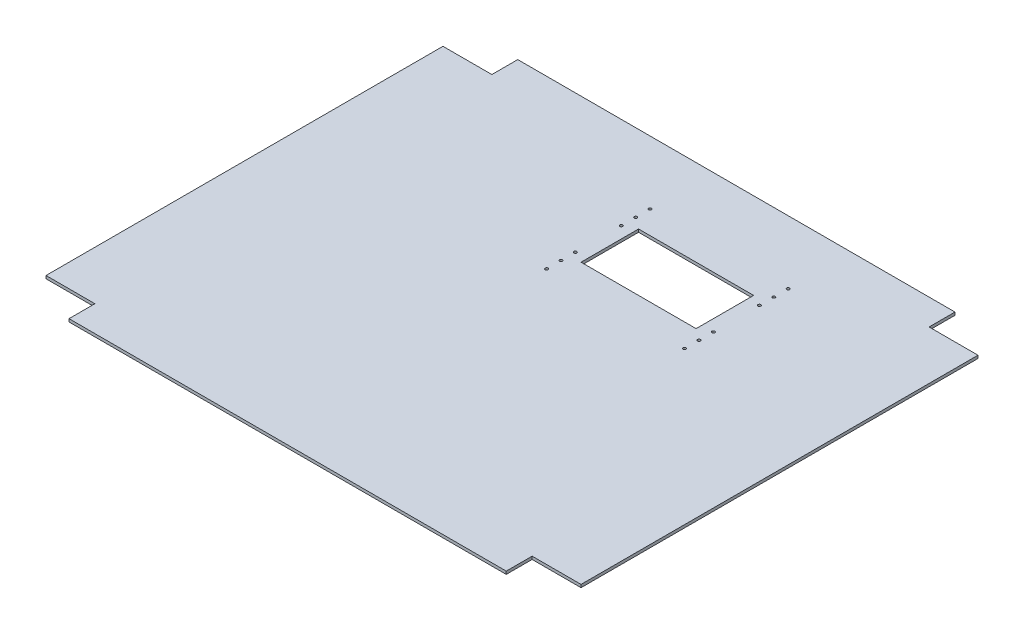
ISO-10303-21;
HEADER;
FILE_DESCRIPTION(('STEP AP214'),'2;1');
FILE_NAME('part.step','',(''),(''),'','','');
FILE_SCHEMA(('AUTOMOTIVE_DESIGN { 1 0 10303 214 1 1 1 1 }'));
ENDSEC;
DATA;
#1=APPLICATION_CONTEXT('core data for automotive mechanical design processes');
#2=APPLICATION_PROTOCOL_DEFINITION('international standard','automotive_design',2000,#1);
#3=PRODUCT_CONTEXT('',#1,'mechanical');
#4=PRODUCT('Part','Part','',(#3));
#5=PRODUCT_RELATED_PRODUCT_CATEGORY('part','',(#4));
#6=PRODUCT_DEFINITION_FORMATION('','',#4);
#7=PRODUCT_DEFINITION_CONTEXT('part definition',#1,'design');
#8=PRODUCT_DEFINITION('design','',#6,#7);
#9=PRODUCT_DEFINITION_SHAPE('','',#8);
#10=(LENGTH_UNIT() NAMED_UNIT(*) SI_UNIT(.MILLI.,.METRE.));
#11=(NAMED_UNIT(*) PLANE_ANGLE_UNIT() SI_UNIT($,.RADIAN.));
#12=(NAMED_UNIT(*) SI_UNIT($,.STERADIAN.) SOLID_ANGLE_UNIT());
#13=UNCERTAINTY_MEASURE_WITH_UNIT(LENGTH_MEASURE(1.E-05),#10,'distance_accuracy_value','');
#14=(GEOMETRIC_REPRESENTATION_CONTEXT(3) GLOBAL_UNCERTAINTY_ASSIGNED_CONTEXT((#13)) GLOBAL_UNIT_ASSIGNED_CONTEXT((#10,
#11,#12)) REPRESENTATION_CONTEXT('',''));
#15=CARTESIAN_POINT('',(0.,0.,0.));
#16=DIRECTION('',(0.,0.,1.));
#17=DIRECTION('',(1.,0.,0.));
#18=AXIS2_PLACEMENT_3D('',#15,#16,#17);
#19=CARTESIAN_POINT('',(0.,0.,0.));
#20=DIRECTION('',(0.,-1.,0.));
#21=DIRECTION('',(0.,0.,-1.));
#22=AXIS2_PLACEMENT_3D('',#19,#20,#21);
#23=PLANE('',#22);
#24=CARTESIAN_POINT('',(200.,0.,-125.));
#25=DIRECTION('',(0.,1.,0.));
#26=DIRECTION('',(0.,0.,1.));
#27=AXIS2_PLACEMENT_3D('',#24,#25,#26);
#28=CIRCLE('',#27,2.5);
#29=CARTESIAN_POINT('',(200.,0.,-122.5));
#30=VERTEX_POINT('',#29);
#31=EDGE_CURVE('E656',#30,#30,#28,.T.);
#32=ORIENTED_EDGE('',*,*,#31,.F.);
#33=EDGE_LOOP('',(#32));
#34=FACE_BOUND('',#33,.T.);
#35=CARTESIAN_POINT('',(200.,0.,-280.));
#36=DIRECTION('',(0.,1.,0.));
#37=DIRECTION('',(0.,0.,1.));
#38=AXIS2_PLACEMENT_3D('',#35,#36,#37);
#39=CIRCLE('',#38,2.5);
#40=CARTESIAN_POINT('',(200.,0.,-277.5));
#41=VERTEX_POINT('',#40);
#42=EDGE_CURVE('E670',#41,#41,#39,.T.);
#43=ORIENTED_EDGE('',*,*,#42,.F.);
#44=EDGE_LOOP('',(#43));
#45=FACE_BOUND('',#44,.T.);
#46=CARTESIAN_POINT('',(200.,0.,-230.));
#47=DIRECTION('',(0.,1.,0.));
#48=DIRECTION('',(0.,0.,1.));
#49=AXIS2_PLACEMENT_3D('',#46,#47,#48);
#50=CIRCLE('',#49,2.5);
#51=CARTESIAN_POINT('',(200.,0.,-227.5));
#52=VERTEX_POINT('',#51);
#53=EDGE_CURVE('E682',#52,#52,#50,.T.);
#54=ORIENTED_EDGE('',*,*,#53,.F.);
#55=EDGE_LOOP('',(#54));
#56=FACE_BOUND('',#55,.T.);
#57=CARTESIAN_POINT('',(-40.0000000000005,0.,-125.));
#58=DIRECTION('',(0.,1.,0.));
#59=DIRECTION('',(0.,0.,1.));
#60=AXIS2_PLACEMENT_3D('',#57,#58,#59);
#61=CIRCLE('',#60,2.5);
#62=CARTESIAN_POINT('',(-40.0000000000005,0.,-122.5));
#63=VERTEX_POINT('',#62);
#64=EDGE_CURVE('E694',#63,#63,#61,.T.);
#65=ORIENTED_EDGE('',*,*,#64,.F.);
#66=EDGE_LOOP('',(#65));
#67=FACE_BOUND('',#66,.T.);
#68=DIRECTION('',(0.,0.,1.));
#69=VECTOR('',#68,1.);
#70=CARTESIAN_POINT('',(-465.,0.,390.));
#71=LINE('',#70,#69);
#72=CARTESIAN_POINT('',(-465.,0.,-345.));
#73=VERTEX_POINT('',#72);
#74=CARTESIAN_POINT('',(-465.,0.,345.));
#75=VERTEX_POINT('',#74);
#76=EDGE_CURVE('E254',#73,#75,#71,.T.);
#77=ORIENTED_EDGE('',*,*,#76,.T.);
#78=DIRECTION('',(-1.,0.,0.));
#79=VECTOR('',#78,1.);
#80=CARTESIAN_POINT('',(-465.,0.,345.));
#81=LINE('',#80,#79);
#82=CARTESIAN_POINT('',(-380.,0.,345.));
#83=VERTEX_POINT('',#82);
#84=EDGE_CURVE('E175',#83,#75,#81,.T.);
#85=ORIENTED_EDGE('',*,*,#84,.F.);
#86=DIRECTION('',(0.,0.,-1.));
#87=VECTOR('',#86,1.);
#88=CARTESIAN_POINT('',(-380.,0.,390.));
#89=LINE('',#88,#87);
#90=CARTESIAN_POINT('',(-380.,0.,390.));
#91=VERTEX_POINT('',#90);
#92=EDGE_CURVE('E167',#91,#83,#89,.T.);
#93=ORIENTED_EDGE('',*,*,#92,.F.);
#94=DIRECTION('',(1.,0.,0.));
#95=VECTOR('',#94,1.);
#96=CARTESIAN_POINT('',(-465.,0.,390.));
#97=LINE('',#96,#95);
#98=CARTESIAN_POINT('',(380.,0.,390.));
#99=VERTEX_POINT('',#98);
#100=EDGE_CURVE('E21',#91,#99,#97,.T.);
#101=ORIENTED_EDGE('',*,*,#100,.T.);
#102=DIRECTION('',(0.,0.,1.));
#103=VECTOR('',#102,1.);
#104=CARTESIAN_POINT('',(380.,0.,390.));
#105=LINE('',#104,#103);
#106=CARTESIAN_POINT('',(380.,0.,345.));
#107=VERTEX_POINT('',#106);
#108=EDGE_CURVE('E193',#107,#99,#105,.T.);
#109=ORIENTED_EDGE('',*,*,#108,.F.);
#110=DIRECTION('',(-1.,0.,0.));
#111=VECTOR('',#110,1.);
#112=CARTESIAN_POINT('',(465.,0.,345.));
#113=LINE('',#112,#111);
#114=CARTESIAN_POINT('',(465.,0.,345.));
#115=VERTEX_POINT('',#114);
#116=EDGE_CURVE('E185',#115,#107,#113,.T.);
#117=ORIENTED_EDGE('',*,*,#116,.F.);
#118=DIRECTION('',(0.,0.,-1.));
#119=VECTOR('',#118,1.);
#120=CARTESIAN_POINT('',(465.,0.,390.));
#121=LINE('',#120,#119);
#122=CARTESIAN_POINT('',(465.,0.,-345.));
#123=VERTEX_POINT('',#122);
#124=EDGE_CURVE('E242',#115,#123,#121,.T.);
#125=ORIENTED_EDGE('',*,*,#124,.T.);
#126=DIRECTION('',(1.,0.,0.));
#127=VECTOR('',#126,1.);
#128=CARTESIAN_POINT('',(465.,0.,-345.));
#129=LINE('',#128,#127);
#130=CARTESIAN_POINT('',(380.,0.,-345.));
#131=VERTEX_POINT('',#130);
#132=EDGE_CURVE('E212',#131,#123,#129,.T.);
#133=ORIENTED_EDGE('',*,*,#132,.F.);
#134=DIRECTION('',(0.,0.,1.));
#135=VECTOR('',#134,1.);
#136=CARTESIAN_POINT('',(380.,0.,-390.));
#137=LINE('',#136,#135);
#138=CARTESIAN_POINT('',(380.,0.,-390.));
#139=VERTEX_POINT('',#138);
#140=EDGE_CURVE('E204',#139,#131,#137,.T.);
#141=ORIENTED_EDGE('',*,*,#140,.F.);
#142=DIRECTION('',(-1.,0.,0.));
#143=VECTOR('',#142,1.);
#144=CARTESIAN_POINT('',(-465.,0.,-390.));
#145=LINE('',#144,#143);
#146=CARTESIAN_POINT('',(-380.,0.,-390.));
#147=VERTEX_POINT('',#146);
#148=EDGE_CURVE('E253',#139,#147,#145,.T.);
#149=ORIENTED_EDGE('',*,*,#148,.T.);
#150=DIRECTION('',(0.,0.,-1.));
#151=VECTOR('',#150,1.);
#152=CARTESIAN_POINT('',(-380.,0.,-390.));
#153=LINE('',#152,#151);
#154=CARTESIAN_POINT('',(-380.,0.,-345.));
#155=VERTEX_POINT('',#154);
#156=EDGE_CURVE('E231',#155,#147,#153,.T.);
#157=ORIENTED_EDGE('',*,*,#156,.F.);
#158=DIRECTION('',(1.,0.,0.));
#159=VECTOR('',#158,1.);
#160=CARTESIAN_POINT('',(-465.,0.,-345.));
#161=LINE('',#160,#159);
#162=EDGE_CURVE('E223',#73,#155,#161,.T.);
#163=ORIENTED_EDGE('',*,*,#162,.F.);
#164=EDGE_LOOP('',(#77,#85,#93,#101,#109,#117,#125,#133,#141,#149,#157,#163));
#165=FACE_BOUND('',#164,.T.);
#166=DIRECTION('',(-1.,0.,0.));
#167=VECTOR('',#166,1.);
#168=CARTESIAN_POINT('',(-20.0000000000002,0.,-240.));
#169=LINE('',#168,#167);
#170=CARTESIAN_POINT('',(180.,0.,-240.));
#171=VERTEX_POINT('',#170);
#172=CARTESIAN_POINT('',(-20.0000000000002,0.,-240.));
#173=VERTEX_POINT('',#172);
#174=EDGE_CURVE('E161',#171,#173,#169,.T.);
#175=ORIENTED_EDGE('',*,*,#174,.F.);
#176=DIRECTION('',(0.,0.,-1.));
#177=VECTOR('',#176,1.);
#178=CARTESIAN_POINT('',(180.,0.,-240.));
#179=LINE('',#178,#177);
#180=CARTESIAN_POINT('',(180.,0.,-140.));
#181=VERTEX_POINT('',#180);
#182=EDGE_CURVE('E42',#181,#171,#179,.T.);
#183=ORIENTED_EDGE('',*,*,#182,.F.);
#184=DIRECTION('',(1.,0.,0.));
#185=VECTOR('',#184,1.);
#186=CARTESIAN_POINT('',(-20.0000000000002,0.,-140.));
#187=LINE('',#186,#185);
#188=CARTESIAN_POINT('',(-20.0000000000002,0.,-140.));
#189=VERTEX_POINT('',#188);
#190=EDGE_CURVE('E149',#189,#181,#187,.T.);
#191=ORIENTED_EDGE('',*,*,#190,.F.);
#192=DIRECTION('',(0.,0.,1.));
#193=VECTOR('',#192,1.);
#194=CARTESIAN_POINT('',(-20.0000000000002,0.,-240.));
#195=LINE('',#194,#193);
#196=EDGE_CURVE('E152',#173,#189,#195,.T.);
#197=ORIENTED_EDGE('',*,*,#196,.F.);
#198=EDGE_LOOP('',(#175,#183,#191,#197));
#199=FACE_BOUND('',#198,.T.);
#200=CARTESIAN_POINT('',(-40.,0.,-230.));
#201=DIRECTION('',(0.,1.,0.));
#202=DIRECTION('',(0.,0.,1.));
#203=AXIS2_PLACEMENT_3D('',#200,#201,#202);
#204=CIRCLE('',#203,2.5);
#205=CARTESIAN_POINT('',(-40.,0.,-227.5));
#206=VERTEX_POINT('',#205);
#207=EDGE_CURVE('E717',#206,#206,#204,.T.);
#208=ORIENTED_EDGE('',*,*,#207,.F.);
#209=EDGE_LOOP('',(#208));
#210=FACE_BOUND('',#209,.T.);
#211=CARTESIAN_POINT('',(-40.,0.,-255.));
#212=DIRECTION('',(0.,1.,0.));
#213=DIRECTION('',(0.,0.,1.));
#214=AXIS2_PLACEMENT_3D('',#211,#212,#213);
#215=CIRCLE('',#214,2.5);
#216=CARTESIAN_POINT('',(-40.,0.,-252.5));
#217=VERTEX_POINT('',#216);
#218=EDGE_CURVE('E712',#217,#217,#215,.T.);
#219=ORIENTED_EDGE('',*,*,#218,.F.);
#220=EDGE_LOOP('',(#219));
#221=FACE_BOUND('',#220,.T.);
#222=CARTESIAN_POINT('',(-40.,0.,-280.));
#223=DIRECTION('',(0.,1.,0.));
#224=DIRECTION('',(0.,0.,1.));
#225=AXIS2_PLACEMENT_3D('',#222,#223,#224);
#226=CIRCLE('',#225,2.5);
#227=CARTESIAN_POINT('',(-40.,0.,-277.5));
#228=VERTEX_POINT('',#227);
#229=EDGE_CURVE('E706',#228,#228,#226,.T.);
#230=ORIENTED_EDGE('',*,*,#229,.F.);
#231=EDGE_LOOP('',(#230));
#232=FACE_BOUND('',#231,.T.);
#233=CARTESIAN_POINT('',(-40.0000000000005,0.,-100.));
#234=DIRECTION('',(0.,1.,0.));
#235=DIRECTION('',(0.,0.,1.));
#236=AXIS2_PLACEMENT_3D('',#233,#234,#235);
#237=CIRCLE('',#236,2.5);
#238=CARTESIAN_POINT('',(-40.0000000000005,0.,-97.5));
#239=VERTEX_POINT('',#238);
#240=EDGE_CURVE('E700',#239,#239,#237,.T.);
#241=ORIENTED_EDGE('',*,*,#240,.F.);
#242=EDGE_LOOP('',(#241));
#243=FACE_BOUND('',#242,.T.);
#244=CARTESIAN_POINT('',(-40.0000000000005,0.,-150.));
#245=DIRECTION('',(0.,1.,0.));
#246=DIRECTION('',(0.,0.,1.));
#247=AXIS2_PLACEMENT_3D('',#244,#245,#246);
#248=CIRCLE('',#247,2.5);
#249=CARTESIAN_POINT('',(-40.0000000000005,0.,-147.5));
#250=VERTEX_POINT('',#249);
#251=EDGE_CURVE('E688',#250,#250,#248,.T.);
#252=ORIENTED_EDGE('',*,*,#251,.F.);
#253=EDGE_LOOP('',(#252));
#254=FACE_BOUND('',#253,.T.);
#255=CARTESIAN_POINT('',(200.,0.,-255.));
#256=DIRECTION('',(0.,1.,0.));
#257=DIRECTION('',(0.,0.,1.));
#258=AXIS2_PLACEMENT_3D('',#255,#256,#257);
#259=CIRCLE('',#258,2.5);
#260=CARTESIAN_POINT('',(200.,0.,-252.5));
#261=VERTEX_POINT('',#260);
#262=EDGE_CURVE('E676',#261,#261,#259,.T.);
#263=ORIENTED_EDGE('',*,*,#262,.F.);
#264=EDGE_LOOP('',(#263));
#265=FACE_BOUND('',#264,.T.);
#266=CARTESIAN_POINT('',(200.,0.,-100.));
#267=DIRECTION('',(0.,1.,0.));
#268=DIRECTION('',(0.,0.,1.));
#269=AXIS2_PLACEMENT_3D('',#266,#267,#268);
#270=CIRCLE('',#269,2.5);
#271=CARTESIAN_POINT('',(200.,0.,-97.5));
#272=VERTEX_POINT('',#271);
#273=EDGE_CURVE('E664',#272,#272,#270,.T.);
#274=ORIENTED_EDGE('',*,*,#273,.F.);
#275=EDGE_LOOP('',(#274));
#276=FACE_BOUND('',#275,.T.);
#277=CARTESIAN_POINT('',(200.,0.,-150.));
#278=DIRECTION('',(0.,1.,0.));
#279=DIRECTION('',(0.,0.,1.));
#280=AXIS2_PLACEMENT_3D('',#277,#278,#279);
#281=CIRCLE('',#280,2.5);
#282=CARTESIAN_POINT('',(200.,0.,-147.5));
#283=VERTEX_POINT('',#282);
#284=EDGE_CURVE('E653',#283,#283,#281,.T.);
#285=ORIENTED_EDGE('',*,*,#284,.F.);
#286=EDGE_LOOP('',(#285));
#287=FACE_BOUND('',#286,.T.);
#288=ADVANCED_FACE('F17',(#34,#45,#56,#67,#165,#199,#210,#221,#232,#243,#254,#265,#276,#287),
#23,.F.);
#289=CARTESIAN_POINT('',(0.,-5.,0.));
#290=DIRECTION('',(0.,-1.,0.));
#291=DIRECTION('',(0.,0.,-1.));
#292=AXIS2_PLACEMENT_3D('',#289,#290,#291);
#293=PLANE('',#292);
#294=CARTESIAN_POINT('',(200.,-5.,-125.));
#295=DIRECTION('',(0.,1.,0.));
#296=DIRECTION('',(0.,0.,1.));
#297=AXIS2_PLACEMENT_3D('',#294,#295,#296);
#298=CIRCLE('',#297,2.5);
#299=CARTESIAN_POINT('',(200.,-5.,-122.5));
#300=VERTEX_POINT('',#299);
#301=EDGE_CURVE('E661',#300,#300,#298,.T.);
#302=ORIENTED_EDGE('',*,*,#301,.T.);
#303=EDGE_LOOP('',(#302));
#304=FACE_BOUND('',#303,.T.);
#305=CARTESIAN_POINT('',(200.,-5.,-280.));
#306=DIRECTION('',(0.,1.,0.));
#307=DIRECTION('',(0.,0.,1.));
#308=AXIS2_PLACEMENT_3D('',#305,#306,#307);
#309=CIRCLE('',#308,2.5);
#310=CARTESIAN_POINT('',(200.,-5.,-277.5));
#311=VERTEX_POINT('',#310);
#312=EDGE_CURVE('E673',#311,#311,#309,.T.);
#313=ORIENTED_EDGE('',*,*,#312,.T.);
#314=EDGE_LOOP('',(#313));
#315=FACE_BOUND('',#314,.T.);
#316=CARTESIAN_POINT('',(200.,-5.,-230.));
#317=DIRECTION('',(0.,1.,0.));
#318=DIRECTION('',(0.,0.,1.));
#319=AXIS2_PLACEMENT_3D('',#316,#317,#318);
#320=CIRCLE('',#319,2.5);
#321=CARTESIAN_POINT('',(200.,-5.,-227.5));
#322=VERTEX_POINT('',#321);
#323=EDGE_CURVE('E685',#322,#322,#320,.T.);
#324=ORIENTED_EDGE('',*,*,#323,.T.);
#325=EDGE_LOOP('',(#324));
#326=FACE_BOUND('',#325,.T.);
#327=CARTESIAN_POINT('',(-40.0000000000005,-5.,-125.));
#328=DIRECTION('',(0.,1.,0.));
#329=DIRECTION('',(0.,0.,1.));
#330=AXIS2_PLACEMENT_3D('',#327,#328,#329);
#331=CIRCLE('',#330,2.5);
#332=CARTESIAN_POINT('',(-40.0000000000005,-5.,-122.5));
#333=VERTEX_POINT('',#332);
#334=EDGE_CURVE('E697',#333,#333,#331,.T.);
#335=ORIENTED_EDGE('',*,*,#334,.T.);
#336=EDGE_LOOP('',(#335));
#337=FACE_BOUND('',#336,.T.);
#338=CARTESIAN_POINT('',(-40.,-5.,-255.));
#339=DIRECTION('',(0.,1.,0.));
#340=DIRECTION('',(0.,0.,1.));
#341=AXIS2_PLACEMENT_3D('',#338,#339,#340);
#342=CIRCLE('',#341,2.5);
#343=CARTESIAN_POINT('',(-40.,-5.,-252.5));
#344=VERTEX_POINT('',#343);
#345=EDGE_CURVE('E715',#344,#344,#342,.T.);
#346=ORIENTED_EDGE('',*,*,#345,.T.);
#347=EDGE_LOOP('',(#346));
#348=FACE_BOUND('',#347,.T.);
#349=CARTESIAN_POINT('',(-40.,-5.,-230.));
#350=DIRECTION('',(0.,1.,0.));
#351=DIRECTION('',(0.,0.,1.));
#352=AXIS2_PLACEMENT_3D('',#349,#350,#351);
#353=CIRCLE('',#352,2.5);
#354=CARTESIAN_POINT('',(-40.,-5.,-227.5));
#355=VERTEX_POINT('',#354);
#356=EDGE_CURVE('E155',#355,#355,#353,.T.);
#357=ORIENTED_EDGE('',*,*,#356,.T.);
#358=EDGE_LOOP('',(#357));
#359=FACE_BOUND('',#358,.T.);
#360=DIRECTION('',(0.,0.,-1.));
#361=VECTOR('',#360,1.);
#362=CARTESIAN_POINT('',(180.,-5.,-240.));
#363=LINE('',#362,#361);
#364=CARTESIAN_POINT('',(180.,-5.,-140.));
#365=VERTEX_POINT('',#364);
#366=CARTESIAN_POINT('',(180.,-5.,-240.));
#367=VERTEX_POINT('',#366);
#368=EDGE_CURVE('E133',#365,#367,#363,.T.);
#369=ORIENTED_EDGE('',*,*,#368,.T.);
#370=DIRECTION('',(-1.,0.,0.));
#371=VECTOR('',#370,1.);
#372=CARTESIAN_POINT('',(-20.0000000000002,-5.,-240.));
#373=LINE('',#372,#371);
#374=CARTESIAN_POINT('',(-20.0000000000002,-5.,-240.));
#375=VERTEX_POINT('',#374);
#376=EDGE_CURVE('E142',#367,#375,#373,.T.);
#377=ORIENTED_EDGE('',*,*,#376,.T.);
#378=DIRECTION('',(0.,0.,1.));
#379=VECTOR('',#378,1.);
#380=CARTESIAN_POINT('',(-20.0000000000002,-5.,-240.));
#381=LINE('',#380,#379);
#382=CARTESIAN_POINT('',(-20.0000000000002,-5.,-140.));
#383=VERTEX_POINT('',#382);
#384=EDGE_CURVE('E34',#375,#383,#381,.T.);
#385=ORIENTED_EDGE('',*,*,#384,.T.);
#386=DIRECTION('',(1.,0.,0.));
#387=VECTOR('',#386,1.);
#388=CARTESIAN_POINT('',(-20.0000000000002,-5.,-140.));
#389=LINE('',#388,#387);
#390=EDGE_CURVE('E139',#383,#365,#389,.T.);
#391=ORIENTED_EDGE('',*,*,#390,.T.);
#392=EDGE_LOOP('',(#369,#377,#385,#391));
#393=FACE_BOUND('',#392,.T.);
#394=DIRECTION('',(-1.,0.,0.));
#395=VECTOR('',#394,1.);
#396=CARTESIAN_POINT('',(-465.,-5.,345.));
#397=LINE('',#396,#395);
#398=CARTESIAN_POINT('',(-380.,-5.,345.));
#399=VERTEX_POINT('',#398);
#400=CARTESIAN_POINT('',(-465.,-5.,345.));
#401=VERTEX_POINT('',#400);
#402=EDGE_CURVE('E174',#399,#401,#397,.T.);
#403=ORIENTED_EDGE('',*,*,#402,.T.);
#404=DIRECTION('',(0.,0.,1.));
#405=VECTOR('',#404,1.);
#406=CARTESIAN_POINT('',(-465.,-5.,390.));
#407=LINE('',#406,#405);
#408=CARTESIAN_POINT('',(-465.,-5.,-345.));
#409=VERTEX_POINT('',#408);
#410=EDGE_CURVE('E26',#409,#401,#407,.T.);
#411=ORIENTED_EDGE('',*,*,#410,.F.);
#412=DIRECTION('',(1.,0.,0.));
#413=VECTOR('',#412,1.);
#414=CARTESIAN_POINT('',(-465.,-5.,-345.));
#415=LINE('',#414,#413);
#416=CARTESIAN_POINT('',(-380.,-5.,-345.));
#417=VERTEX_POINT('',#416);
#418=EDGE_CURVE('E227',#409,#417,#415,.T.);
#419=ORIENTED_EDGE('',*,*,#418,.T.);
#420=DIRECTION('',(0.,0.,-1.));
#421=VECTOR('',#420,1.);
#422=CARTESIAN_POINT('',(-380.,-5.,-390.));
#423=LINE('',#422,#421);
#424=CARTESIAN_POINT('',(-380.,-5.,-390.));
#425=VERTEX_POINT('',#424);
#426=EDGE_CURVE('E230',#417,#425,#423,.T.);
#427=ORIENTED_EDGE('',*,*,#426,.T.);
#428=DIRECTION('',(-1.,0.,0.));
#429=VECTOR('',#428,1.);
#430=CARTESIAN_POINT('',(-465.,-5.,-390.));
#431=LINE('',#430,#429);
#432=CARTESIAN_POINT('',(380.,-5.,-390.));
#433=VERTEX_POINT('',#432);
#434=EDGE_CURVE('E248',#433,#425,#431,.T.);
#435=ORIENTED_EDGE('',*,*,#434,.F.);
#436=DIRECTION('',(0.,0.,1.));
#437=VECTOR('',#436,1.);
#438=CARTESIAN_POINT('',(380.,-5.,-390.));
#439=LINE('',#438,#437);
#440=CARTESIAN_POINT('',(380.,-5.,-345.));
#441=VERTEX_POINT('',#440);
#442=EDGE_CURVE('E208',#433,#441,#439,.T.);
#443=ORIENTED_EDGE('',*,*,#442,.T.);
#444=DIRECTION('',(1.,0.,0.));
#445=VECTOR('',#444,1.);
#446=CARTESIAN_POINT('',(465.,-5.,-345.));
#447=LINE('',#446,#445);
#448=CARTESIAN_POINT('',(465.,-5.,-345.));
#449=VERTEX_POINT('',#448);
#450=EDGE_CURVE('E211',#441,#449,#447,.T.);
#451=ORIENTED_EDGE('',*,*,#450,.T.);
#452=DIRECTION('',(0.,0.,-1.));
#453=VECTOR('',#452,1.);
#454=CARTESIAN_POINT('',(465.,-5.,390.));
#455=LINE('',#454,#453);
#456=CARTESIAN_POINT('',(465.,-5.,345.));
#457=VERTEX_POINT('',#456);
#458=EDGE_CURVE('E246',#457,#449,#455,.T.);
#459=ORIENTED_EDGE('',*,*,#458,.F.);
#460=DIRECTION('',(-1.,0.,0.));
#461=VECTOR('',#460,1.);
#462=CARTESIAN_POINT('',(465.,-5.,345.));
#463=LINE('',#462,#461);
#464=CARTESIAN_POINT('',(380.,-5.,345.));
#465=VERTEX_POINT('',#464);
#466=EDGE_CURVE('E189',#457,#465,#463,.T.);
#467=ORIENTED_EDGE('',*,*,#466,.T.);
#468=DIRECTION('',(0.,0.,1.));
#469=VECTOR('',#468,1.);
#470=CARTESIAN_POINT('',(380.,-5.,390.));
#471=LINE('',#470,#469);
#472=CARTESIAN_POINT('',(380.,-5.,390.));
#473=VERTEX_POINT('',#472);
#474=EDGE_CURVE('E192',#465,#473,#471,.T.);
#475=ORIENTED_EDGE('',*,*,#474,.T.);
#476=DIRECTION('',(1.,0.,0.));
#477=VECTOR('',#476,1.);
#478=CARTESIAN_POINT('',(-465.,-5.,390.));
#479=LINE('',#478,#477);
#480=CARTESIAN_POINT('',(-380.,-5.,390.));
#481=VERTEX_POINT('',#480);
#482=EDGE_CURVE('E11',#481,#473,#479,.T.);
#483=ORIENTED_EDGE('',*,*,#482,.F.);
#484=DIRECTION('',(0.,0.,-1.));
#485=VECTOR('',#484,1.);
#486=CARTESIAN_POINT('',(-380.,-5.,390.));
#487=LINE('',#486,#485);
#488=EDGE_CURVE('E171',#481,#399,#487,.T.);
#489=ORIENTED_EDGE('',*,*,#488,.T.);
#490=EDGE_LOOP('',(#403,#411,#419,#427,#435,#443,#451,#459,#467,#475,#483,#489));
#491=FACE_BOUND('',#490,.T.);
#492=CARTESIAN_POINT('',(-40.,-5.,-280.));
#493=DIRECTION('',(0.,1.,0.));
#494=DIRECTION('',(0.,0.,1.));
#495=AXIS2_PLACEMENT_3D('',#492,#493,#494);
#496=CIRCLE('',#495,2.5);
#497=CARTESIAN_POINT('',(-40.,-5.,-277.5));
#498=VERTEX_POINT('',#497);
#499=EDGE_CURVE('E709',#498,#498,#496,.T.);
#500=ORIENTED_EDGE('',*,*,#499,.T.);
#501=EDGE_LOOP('',(#500));
#502=FACE_BOUND('',#501,.T.);
#503=CARTESIAN_POINT('',(-40.0000000000005,-5.,-100.));
#504=DIRECTION('',(0.,1.,0.));
#505=DIRECTION('',(0.,0.,1.));
#506=AXIS2_PLACEMENT_3D('',#503,#504,#505);
#507=CIRCLE('',#506,2.5);
#508=CARTESIAN_POINT('',(-40.0000000000005,-5.,-97.5));
#509=VERTEX_POINT('',#508);
#510=EDGE_CURVE('E703',#509,#509,#507,.T.);
#511=ORIENTED_EDGE('',*,*,#510,.T.);
#512=EDGE_LOOP('',(#511));
#513=FACE_BOUND('',#512,.T.);
#514=CARTESIAN_POINT('',(-40.0000000000005,-5.,-150.));
#515=DIRECTION('',(0.,1.,0.));
#516=DIRECTION('',(0.,0.,1.));
#517=AXIS2_PLACEMENT_3D('',#514,#515,#516);
#518=CIRCLE('',#517,2.5);
#519=CARTESIAN_POINT('',(-40.0000000000005,-5.,-147.5));
#520=VERTEX_POINT('',#519);
#521=EDGE_CURVE('E691',#520,#520,#518,.T.);
#522=ORIENTED_EDGE('',*,*,#521,.T.);
#523=EDGE_LOOP('',(#522));
#524=FACE_BOUND('',#523,.T.);
#525=CARTESIAN_POINT('',(200.,-5.,-255.));
#526=DIRECTION('',(0.,1.,0.));
#527=DIRECTION('',(0.,0.,1.));
#528=AXIS2_PLACEMENT_3D('',#525,#526,#527);
#529=CIRCLE('',#528,2.5);
#530=CARTESIAN_POINT('',(200.,-5.,-252.5));
#531=VERTEX_POINT('',#530);
#532=EDGE_CURVE('E679',#531,#531,#529,.T.);
#533=ORIENTED_EDGE('',*,*,#532,.T.);
#534=EDGE_LOOP('',(#533));
#535=FACE_BOUND('',#534,.T.);
#536=CARTESIAN_POINT('',(200.,-5.,-100.));
#537=DIRECTION('',(0.,1.,0.));
#538=DIRECTION('',(0.,0.,1.));
#539=AXIS2_PLACEMENT_3D('',#536,#537,#538);
#540=CIRCLE('',#539,2.5);
#541=CARTESIAN_POINT('',(200.,-5.,-97.5));
#542=VERTEX_POINT('',#541);
#543=EDGE_CURVE('E667',#542,#542,#540,.T.);
#544=ORIENTED_EDGE('',*,*,#543,.T.);
#545=EDGE_LOOP('',(#544));
#546=FACE_BOUND('',#545,.T.);
#547=CARTESIAN_POINT('',(200.,-5.,-150.));
#548=DIRECTION('',(0.,1.,0.));
#549=DIRECTION('',(0.,0.,1.));
#550=AXIS2_PLACEMENT_3D('',#547,#548,#549);
#551=CIRCLE('',#550,2.5);
#552=CARTESIAN_POINT('',(200.,-5.,-147.5));
#553=VERTEX_POINT('',#552);
#554=EDGE_CURVE('E650',#553,#553,#551,.T.);
#555=ORIENTED_EDGE('',*,*,#554,.T.);
#556=EDGE_LOOP('',(#555));
#557=FACE_BOUND('',#556,.T.);
#558=ADVANCED_FACE('F146',(#304,#315,#326,#337,#348,#359,#393,#491,#502,#513,#524,#535,#546,
#557),#293,.T.);
#559=CARTESIAN_POINT('',(465.,-5.,390.));
#560=DIRECTION('',(1.,0.,0.));
#561=DIRECTION('',(0.,0.,-1.));
#562=AXIS2_PLACEMENT_3D('',#559,#560,#561);
#563=PLANE('',#562);
#564=DIRECTION('',(0.,1.,0.));
#565=VECTOR('',#564,1.);
#566=CARTESIAN_POINT('',(465.,-5.,345.));
#567=LINE('',#566,#565);
#568=EDGE_CURVE('E196',#457,#115,#567,.T.);
#569=ORIENTED_EDGE('',*,*,#568,.F.);
#570=ORIENTED_EDGE('',*,*,#458,.T.);
#571=DIRECTION('',(0.,1.,0.));
#572=VECTOR('',#571,1.);
#573=CARTESIAN_POINT('',(465.,-5.,-345.));
#574=LINE('',#573,#572);
#575=EDGE_CURVE('E220',#449,#123,#574,.T.);
#576=ORIENTED_EDGE('',*,*,#575,.T.);
#577=ORIENTED_EDGE('',*,*,#124,.F.);
#578=EDGE_LOOP('',(#569,#570,#576,#577));
#579=FACE_BOUND('',#578,.T.);
#580=ADVANCED_FACE('F19',(#579),#563,.T.);
#581=CARTESIAN_POINT('',(-465.,-5.,390.));
#582=DIRECTION('',(0.,0.,1.));
#583=DIRECTION('',(1.,0.,0.));
#584=AXIS2_PLACEMENT_3D('',#581,#582,#583);
#585=PLANE('',#584);
#586=DIRECTION('',(0.,1.,0.));
#587=VECTOR('',#586,1.);
#588=CARTESIAN_POINT('',(-380.,-5.,390.));
#589=LINE('',#588,#587);
#590=EDGE_CURVE('E178',#481,#91,#589,.T.);
#591=ORIENTED_EDGE('',*,*,#590,.F.);
#592=ORIENTED_EDGE('',*,*,#482,.T.);
#593=DIRECTION('',(0.,1.,0.));
#594=VECTOR('',#593,1.);
#595=CARTESIAN_POINT('',(380.,-5.,390.));
#596=LINE('',#595,#594);
#597=EDGE_CURVE('E201',#473,#99,#596,.T.);
#598=ORIENTED_EDGE('',*,*,#597,.T.);
#599=ORIENTED_EDGE('',*,*,#100,.F.);
#600=EDGE_LOOP('',(#591,#592,#598,#599));
#601=FACE_BOUND('',#600,.T.);
#602=ADVANCED_FACE('F271',(#601),#585,.T.);
#603=CARTESIAN_POINT('',(-465.,-5.,390.));
#604=DIRECTION('',(-1.,0.,0.));
#605=DIRECTION('',(0.,0.,1.));
#606=AXIS2_PLACEMENT_3D('',#603,#604,#605);
#607=PLANE('',#606);
#608=DIRECTION('',(0.,1.,0.));
#609=VECTOR('',#608,1.);
#610=CARTESIAN_POINT('',(-465.,-5.,345.));
#611=LINE('',#610,#609);
#612=EDGE_CURVE('E182',#401,#75,#611,.T.);
#613=ORIENTED_EDGE('',*,*,#612,.T.);
#614=ORIENTED_EDGE('',*,*,#76,.F.);
#615=DIRECTION('',(0.,1.,0.));
#616=VECTOR('',#615,1.);
#617=CARTESIAN_POINT('',(-465.,-5.,-345.));
#618=LINE('',#617,#616);
#619=EDGE_CURVE('E234',#409,#73,#618,.T.);
#620=ORIENTED_EDGE('',*,*,#619,.F.);
#621=ORIENTED_EDGE('',*,*,#410,.T.);
#622=EDGE_LOOP('',(#613,#614,#620,#621));
#623=FACE_BOUND('',#622,.T.);
#624=ADVANCED_FACE('F303',(#623),#607,.T.);
#625=CARTESIAN_POINT('',(-465.,-5.,-390.));
#626=DIRECTION('',(0.,0.,-1.));
#627=DIRECTION('',(-1.,0.,0.));
#628=AXIS2_PLACEMENT_3D('',#625,#626,#627);
#629=PLANE('',#628);
#630=DIRECTION('',(0.,1.,0.));
#631=VECTOR('',#630,1.);
#632=CARTESIAN_POINT('',(380.,-5.,-390.));
#633=LINE('',#632,#631);
#634=EDGE_CURVE('E215',#433,#139,#633,.T.);
#635=ORIENTED_EDGE('',*,*,#634,.F.);
#636=ORIENTED_EDGE('',*,*,#434,.T.);
#637=DIRECTION('',(0.,1.,0.));
#638=VECTOR('',#637,1.);
#639=CARTESIAN_POINT('',(-380.,-5.,-390.));
#640=LINE('',#639,#638);
#641=EDGE_CURVE('E239',#425,#147,#640,.T.);
#642=ORIENTED_EDGE('',*,*,#641,.T.);
#643=ORIENTED_EDGE('',*,*,#148,.F.);
#644=EDGE_LOOP('',(#635,#636,#642,#643));
#645=FACE_BOUND('',#644,.T.);
#646=ADVANCED_FACE('F292',(#645),#629,.T.);
#647=CARTESIAN_POINT('',(-380.,-5.,-390.));
#648=DIRECTION('',(1.,0.,0.));
#649=DIRECTION('',(0.,0.,-1.));
#650=AXIS2_PLACEMENT_3D('',#647,#648,#649);
#651=PLANE('',#650);
#652=ORIENTED_EDGE('',*,*,#156,.T.);
#653=ORIENTED_EDGE('',*,*,#641,.F.);
#654=ORIENTED_EDGE('',*,*,#426,.F.);
#655=DIRECTION('',(0.,1.,0.));
#656=VECTOR('',#655,1.);
#657=CARTESIAN_POINT('',(-380.,-5.,-345.));
#658=LINE('',#657,#656);
#659=EDGE_CURVE('E243',#417,#155,#658,.T.);
#660=ORIENTED_EDGE('',*,*,#659,.T.);
#661=EDGE_LOOP('',(#652,#653,#654,#660));
#662=FACE_BOUND('',#661,.T.);
#663=ADVANCED_FACE('F297',(#662),#651,.F.);
#664=CARTESIAN_POINT('',(-465.,-5.,-345.));
#665=DIRECTION('',(0.,0.,1.));
#666=DIRECTION('',(1.,0.,0.));
#667=AXIS2_PLACEMENT_3D('',#664,#665,#666);
#668=PLANE('',#667);
#669=ORIENTED_EDGE('',*,*,#162,.T.);
#670=ORIENTED_EDGE('',*,*,#659,.F.);
#671=ORIENTED_EDGE('',*,*,#418,.F.);
#672=ORIENTED_EDGE('',*,*,#619,.T.);
#673=EDGE_LOOP('',(#669,#670,#671,#672));
#674=FACE_BOUND('',#673,.T.);
#675=ADVANCED_FACE('F301',(#674),#668,.F.);
#676=CARTESIAN_POINT('',(465.,-5.,-345.));
#677=DIRECTION('',(0.,0.,1.));
#678=DIRECTION('',(1.,0.,0.));
#679=AXIS2_PLACEMENT_3D('',#676,#677,#678);
#680=PLANE('',#679);
#681=ORIENTED_EDGE('',*,*,#132,.T.);
#682=ORIENTED_EDGE('',*,*,#575,.F.);
#683=ORIENTED_EDGE('',*,*,#450,.F.);
#684=DIRECTION('',(0.,1.,0.));
#685=VECTOR('',#684,1.);
#686=CARTESIAN_POINT('',(380.,-5.,-345.));
#687=LINE('',#686,#685);
#688=EDGE_CURVE('E224',#441,#131,#687,.T.);
#689=ORIENTED_EDGE('',*,*,#688,.T.);
#690=EDGE_LOOP('',(#681,#682,#683,#689));
#691=FACE_BOUND('',#690,.T.);
#692=ADVANCED_FACE('F284',(#691),#680,.F.);
#693=CARTESIAN_POINT('',(380.,-5.,-390.));
#694=DIRECTION('',(-1.,0.,0.));
#695=DIRECTION('',(0.,0.,1.));
#696=AXIS2_PLACEMENT_3D('',#693,#694,#695);
#697=PLANE('',#696);
#698=ORIENTED_EDGE('',*,*,#140,.T.);
#699=ORIENTED_EDGE('',*,*,#688,.F.);
#700=ORIENTED_EDGE('',*,*,#442,.F.);
#701=ORIENTED_EDGE('',*,*,#634,.T.);
#702=EDGE_LOOP('',(#698,#699,#700,#701));
#703=FACE_BOUND('',#702,.T.);
#704=ADVANCED_FACE('F287',(#703),#697,.F.);
#705=CARTESIAN_POINT('',(380.,-5.,390.));
#706=DIRECTION('',(-1.,0.,0.));
#707=DIRECTION('',(0.,0.,1.));
#708=AXIS2_PLACEMENT_3D('',#705,#706,#707);
#709=PLANE('',#708);
#710=ORIENTED_EDGE('',*,*,#108,.T.);
#711=ORIENTED_EDGE('',*,*,#597,.F.);
#712=ORIENTED_EDGE('',*,*,#474,.F.);
#713=DIRECTION('',(0.,1.,0.));
#714=VECTOR('',#713,1.);
#715=CARTESIAN_POINT('',(380.,-5.,345.));
#716=LINE('',#715,#714);
#717=EDGE_CURVE('E205',#465,#107,#716,.T.);
#718=ORIENTED_EDGE('',*,*,#717,.T.);
#719=EDGE_LOOP('',(#710,#711,#712,#718));
#720=FACE_BOUND('',#719,.T.);
#721=ADVANCED_FACE('F269',(#720),#709,.F.);
#722=CARTESIAN_POINT('',(465.,-5.,345.));
#723=DIRECTION('',(0.,0.,-1.));
#724=DIRECTION('',(-1.,0.,0.));
#725=AXIS2_PLACEMENT_3D('',#722,#723,#724);
#726=PLANE('',#725);
#727=ORIENTED_EDGE('',*,*,#116,.T.);
#728=ORIENTED_EDGE('',*,*,#717,.F.);
#729=ORIENTED_EDGE('',*,*,#466,.F.);
#730=ORIENTED_EDGE('',*,*,#568,.T.);
#731=EDGE_LOOP('',(#727,#728,#729,#730));
#732=FACE_BOUND('',#731,.T.);
#733=ADVANCED_FACE('F277',(#732),#726,.F.);
#734=CARTESIAN_POINT('',(-465.,-5.,345.));
#735=DIRECTION('',(0.,0.,-1.));
#736=DIRECTION('',(-1.,0.,0.));
#737=AXIS2_PLACEMENT_3D('',#734,#735,#736);
#738=PLANE('',#737);
#739=ORIENTED_EDGE('',*,*,#84,.T.);
#740=ORIENTED_EDGE('',*,*,#612,.F.);
#741=ORIENTED_EDGE('',*,*,#402,.F.);
#742=DIRECTION('',(0.,1.,0.));
#743=VECTOR('',#742,1.);
#744=CARTESIAN_POINT('',(-380.,-5.,345.));
#745=LINE('',#744,#743);
#746=EDGE_CURVE('E186',#399,#83,#745,.T.);
#747=ORIENTED_EDGE('',*,*,#746,.T.);
#748=EDGE_LOOP('',(#739,#740,#741,#747));
#749=FACE_BOUND('',#748,.T.);
#750=ADVANCED_FACE('F306',(#749),#738,.F.);
#751=CARTESIAN_POINT('',(-380.,-5.,390.));
#752=DIRECTION('',(1.,0.,0.));
#753=DIRECTION('',(0.,0.,-1.));
#754=AXIS2_PLACEMENT_3D('',#751,#752,#753);
#755=PLANE('',#754);
#756=ORIENTED_EDGE('',*,*,#92,.T.);
#757=ORIENTED_EDGE('',*,*,#746,.F.);
#758=ORIENTED_EDGE('',*,*,#488,.F.);
#759=ORIENTED_EDGE('',*,*,#590,.T.);
#760=EDGE_LOOP('',(#756,#757,#758,#759));
#761=FACE_BOUND('',#760,.T.);
#762=ADVANCED_FACE('F308',(#761),#755,.F.);
#763=CARTESIAN_POINT('',(180.,-5.,-240.));
#764=DIRECTION('',(1.,0.,0.));
#765=DIRECTION('',(0.,0.,-1.));
#766=AXIS2_PLACEMENT_3D('',#763,#764,#765);
#767=PLANE('',#766);
#768=ORIENTED_EDGE('',*,*,#182,.T.);
#769=DIRECTION('',(0.,1.,0.));
#770=VECTOR('',#769,1.);
#771=CARTESIAN_POINT('',(180.,-5.,-240.));
#772=LINE('',#771,#770);
#773=EDGE_CURVE('E129',#367,#171,#772,.T.);
#774=ORIENTED_EDGE('',*,*,#773,.F.);
#775=ORIENTED_EDGE('',*,*,#368,.F.);
#776=DIRECTION('',(0.,1.,0.));
#777=VECTOR('',#776,1.);
#778=CARTESIAN_POINT('',(180.,-5.,-140.));
#779=LINE('',#778,#777);
#780=EDGE_CURVE('E165',#365,#181,#779,.T.);
#781=ORIENTED_EDGE('',*,*,#780,.T.);
#782=EDGE_LOOP('',(#768,#774,#775,#781));
#783=FACE_BOUND('',#782,.T.);
#784=ADVANCED_FACE('F131',(#783),#767,.F.);
#785=CARTESIAN_POINT('',(-20.0000000000002,-5.,-140.));
#786=DIRECTION('',(0.,0.,1.));
#787=DIRECTION('',(1.,0.,0.));
#788=AXIS2_PLACEMENT_3D('',#785,#786,#787);
#789=PLANE('',#788);
#790=ORIENTED_EDGE('',*,*,#190,.T.);
#791=ORIENTED_EDGE('',*,*,#780,.F.);
#792=ORIENTED_EDGE('',*,*,#390,.F.);
#793=DIRECTION('',(0.,1.,0.));
#794=VECTOR('',#793,1.);
#795=CARTESIAN_POINT('',(-20.0000000000002,-5.,-140.));
#796=LINE('',#795,#794);
#797=EDGE_CURVE('E168',#383,#189,#796,.T.);
#798=ORIENTED_EDGE('',*,*,#797,.T.);
#799=EDGE_LOOP('',(#790,#791,#792,#798));
#800=FACE_BOUND('',#799,.T.);
#801=ADVANCED_FACE('F317',(#800),#789,.F.);
#802=CARTESIAN_POINT('',(-20.0000000000002,-5.,-240.));
#803=DIRECTION('',(-1.,0.,0.));
#804=DIRECTION('',(0.,0.,1.));
#805=AXIS2_PLACEMENT_3D('',#802,#803,#804);
#806=PLANE('',#805);
#807=ORIENTED_EDGE('',*,*,#196,.T.);
#808=ORIENTED_EDGE('',*,*,#797,.F.);
#809=ORIENTED_EDGE('',*,*,#384,.F.);
#810=DIRECTION('',(0.,1.,0.));
#811=VECTOR('',#810,1.);
#812=CARTESIAN_POINT('',(-20.0000000000002,-5.,-240.));
#813=LINE('',#812,#811);
#814=EDGE_CURVE('E138',#375,#173,#813,.T.);
#815=ORIENTED_EDGE('',*,*,#814,.T.);
#816=EDGE_LOOP('',(#807,#808,#809,#815));
#817=FACE_BOUND('',#816,.T.);
#818=ADVANCED_FACE('F393',(#817),#806,.F.);
#819=CARTESIAN_POINT('',(-20.0000000000002,-5.,-240.));
#820=DIRECTION('',(0.,0.,-1.));
#821=DIRECTION('',(-1.,0.,0.));
#822=AXIS2_PLACEMENT_3D('',#819,#820,#821);
#823=PLANE('',#822);
#824=ORIENTED_EDGE('',*,*,#174,.T.);
#825=ORIENTED_EDGE('',*,*,#814,.F.);
#826=ORIENTED_EDGE('',*,*,#376,.F.);
#827=ORIENTED_EDGE('',*,*,#773,.T.);
#828=EDGE_LOOP('',(#824,#825,#826,#827));
#829=FACE_BOUND('',#828,.T.);
#830=ADVANCED_FACE('F143',(#829),#823,.F.);
#831=CARTESIAN_POINT('',(-40.,0.,-230.));
#832=DIRECTION('',(0.,1.,0.));
#833=DIRECTION('',(0.,0.,1.));
#834=AXIS2_PLACEMENT_3D('',#831,#832,#833);
#835=CYLINDRICAL_SURFACE('',#834,2.5);
#836=ORIENTED_EDGE('',*,*,#356,.F.);
#837=EDGE_LOOP('',(#836));
#838=FACE_BOUND('',#837,.T.);
#839=ORIENTED_EDGE('',*,*,#207,.T.);
#840=EDGE_LOOP('',(#839));
#841=FACE_BOUND('',#840,.T.);
#842=ADVANCED_FACE('F411',(#838,#841),#835,.F.);
#843=CARTESIAN_POINT('',(-40.,0.,-255.));
#844=DIRECTION('',(0.,1.,0.));
#845=DIRECTION('',(0.,0.,1.));
#846=AXIS2_PLACEMENT_3D('',#843,#844,#845);
#847=CYLINDRICAL_SURFACE('',#846,2.5);
#848=ORIENTED_EDGE('',*,*,#345,.F.);
#849=EDGE_LOOP('',(#848));
#850=FACE_BOUND('',#849,.T.);
#851=ORIENTED_EDGE('',*,*,#218,.T.);
#852=EDGE_LOOP('',(#851));
#853=FACE_BOUND('',#852,.T.);
#854=ADVANCED_FACE('F421',(#850,#853),#847,.F.);
#855=CARTESIAN_POINT('',(-40.,0.,-280.));
#856=DIRECTION('',(0.,1.,0.));
#857=DIRECTION('',(0.,0.,1.));
#858=AXIS2_PLACEMENT_3D('',#855,#856,#857);
#859=CYLINDRICAL_SURFACE('',#858,2.5);
#860=ORIENTED_EDGE('',*,*,#499,.F.);
#861=EDGE_LOOP('',(#860));
#862=FACE_BOUND('',#861,.T.);
#863=ORIENTED_EDGE('',*,*,#229,.T.);
#864=EDGE_LOOP('',(#863));
#865=FACE_BOUND('',#864,.T.);
#866=ADVANCED_FACE('F432',(#862,#865),#859,.F.);
#867=CARTESIAN_POINT('',(-40.0000000000005,0.,-100.));
#868=DIRECTION('',(0.,1.,0.));
#869=DIRECTION('',(0.,0.,1.));
#870=AXIS2_PLACEMENT_3D('',#867,#868,#869);
#871=CYLINDRICAL_SURFACE('',#870,2.5);
#872=ORIENTED_EDGE('',*,*,#510,.F.);
#873=EDGE_LOOP('',(#872));
#874=FACE_BOUND('',#873,.T.);
#875=ORIENTED_EDGE('',*,*,#240,.T.);
#876=EDGE_LOOP('',(#875));
#877=FACE_BOUND('',#876,.T.);
#878=ADVANCED_FACE('F443',(#874,#877),#871,.F.);
#879=CARTESIAN_POINT('',(-40.0000000000005,0.,-125.));
#880=DIRECTION('',(0.,1.,0.));
#881=DIRECTION('',(0.,0.,1.));
#882=AXIS2_PLACEMENT_3D('',#879,#880,#881);
#883=CYLINDRICAL_SURFACE('',#882,2.5);
#884=ORIENTED_EDGE('',*,*,#334,.F.);
#885=EDGE_LOOP('',(#884));
#886=FACE_BOUND('',#885,.T.);
#887=ORIENTED_EDGE('',*,*,#64,.T.);
#888=EDGE_LOOP('',(#887));
#889=FACE_BOUND('',#888,.T.);
#890=ADVANCED_FACE('F454',(#886,#889),#883,.F.);
#891=CARTESIAN_POINT('',(-40.0000000000005,0.,-150.));
#892=DIRECTION('',(0.,1.,0.));
#893=DIRECTION('',(0.,0.,1.));
#894=AXIS2_PLACEMENT_3D('',#891,#892,#893);
#895=CYLINDRICAL_SURFACE('',#894,2.5);
#896=ORIENTED_EDGE('',*,*,#521,.F.);
#897=EDGE_LOOP('',(#896));
#898=FACE_BOUND('',#897,.T.);
#899=ORIENTED_EDGE('',*,*,#251,.T.);
#900=EDGE_LOOP('',(#899));
#901=FACE_BOUND('',#900,.T.);
#902=ADVANCED_FACE('F465',(#898,#901),#895,.F.);
#903=CARTESIAN_POINT('',(200.,0.,-230.));
#904=DIRECTION('',(0.,1.,0.));
#905=DIRECTION('',(0.,0.,1.));
#906=AXIS2_PLACEMENT_3D('',#903,#904,#905);
#907=CYLINDRICAL_SURFACE('',#906,2.5);
#908=ORIENTED_EDGE('',*,*,#323,.F.);
#909=EDGE_LOOP('',(#908));
#910=FACE_BOUND('',#909,.T.);
#911=ORIENTED_EDGE('',*,*,#53,.T.);
#912=EDGE_LOOP('',(#911));
#913=FACE_BOUND('',#912,.T.);
#914=ADVANCED_FACE('F476',(#910,#913),#907,.F.);
#915=CARTESIAN_POINT('',(200.,0.,-255.));
#916=DIRECTION('',(0.,1.,0.));
#917=DIRECTION('',(0.,0.,1.));
#918=AXIS2_PLACEMENT_3D('',#915,#916,#917);
#919=CYLINDRICAL_SURFACE('',#918,2.5);
#920=ORIENTED_EDGE('',*,*,#532,.F.);
#921=EDGE_LOOP('',(#920));
#922=FACE_BOUND('',#921,.T.);
#923=ORIENTED_EDGE('',*,*,#262,.T.);
#924=EDGE_LOOP('',(#923));
#925=FACE_BOUND('',#924,.T.);
#926=ADVANCED_FACE('F487',(#922,#925),#919,.F.);
#927=CARTESIAN_POINT('',(200.,0.,-280.));
#928=DIRECTION('',(0.,1.,0.));
#929=DIRECTION('',(0.,0.,1.));
#930=AXIS2_PLACEMENT_3D('',#927,#928,#929);
#931=CYLINDRICAL_SURFACE('',#930,2.5);
#932=ORIENTED_EDGE('',*,*,#312,.F.);
#933=EDGE_LOOP('',(#932));
#934=FACE_BOUND('',#933,.T.);
#935=ORIENTED_EDGE('',*,*,#42,.T.);
#936=EDGE_LOOP('',(#935));
#937=FACE_BOUND('',#936,.T.);
#938=ADVANCED_FACE('F498',(#934,#937),#931,.F.);
#939=CARTESIAN_POINT('',(200.,0.,-100.));
#940=DIRECTION('',(0.,1.,0.));
#941=DIRECTION('',(0.,0.,1.));
#942=AXIS2_PLACEMENT_3D('',#939,#940,#941);
#943=CYLINDRICAL_SURFACE('',#942,2.5);
#944=ORIENTED_EDGE('',*,*,#543,.F.);
#945=EDGE_LOOP('',(#944));
#946=FACE_BOUND('',#945,.T.);
#947=ORIENTED_EDGE('',*,*,#273,.T.);
#948=EDGE_LOOP('',(#947));
#949=FACE_BOUND('',#948,.T.);
#950=ADVANCED_FACE('F509',(#946,#949),#943,.F.);
#951=CARTESIAN_POINT('',(200.,0.,-125.));
#952=DIRECTION('',(0.,1.,0.));
#953=DIRECTION('',(0.,0.,1.));
#954=AXIS2_PLACEMENT_3D('',#951,#952,#953);
#955=CYLINDRICAL_SURFACE('',#954,2.5);
#956=ORIENTED_EDGE('',*,*,#301,.F.);
#957=EDGE_LOOP('',(#956));
#958=FACE_BOUND('',#957,.T.);
#959=ORIENTED_EDGE('',*,*,#31,.T.);
#960=EDGE_LOOP('',(#959));
#961=FACE_BOUND('',#960,.T.);
#962=ADVANCED_FACE('F520',(#958,#961),#955,.F.);
#963=CARTESIAN_POINT('',(200.,0.,-150.));
#964=DIRECTION('',(0.,1.,0.));
#965=DIRECTION('',(0.,0.,1.));
#966=AXIS2_PLACEMENT_3D('',#963,#964,#965);
#967=CYLINDRICAL_SURFACE('',#966,2.5);
#968=ORIENTED_EDGE('',*,*,#554,.F.);
#969=EDGE_LOOP('',(#968));
#970=FACE_BOUND('',#969,.T.);
#971=ORIENTED_EDGE('',*,*,#284,.T.);
#972=EDGE_LOOP('',(#971));
#973=FACE_BOUND('',#972,.T.);
#974=ADVANCED_FACE('F531',(#970,#973),#967,.F.);
#975=CLOSED_SHELL('',(#288,#558,#580,#602,#624,#646,#663,#675,#692,#704,#721,#733,#750,#762,
#784,#801,#818,#830,#842,#854,#866,#878,#890,#902,#914,#926,#938,#950,#962,#974));
#976=MANIFOLD_SOLID_BREP('B1',#975);
#977=ADVANCED_BREP_SHAPE_REPRESENTATION('',(#18,#976),#14);
#978=SHAPE_DEFINITION_REPRESENTATION(#9,#977);
ENDSEC;
END-ISO-10303-21;
